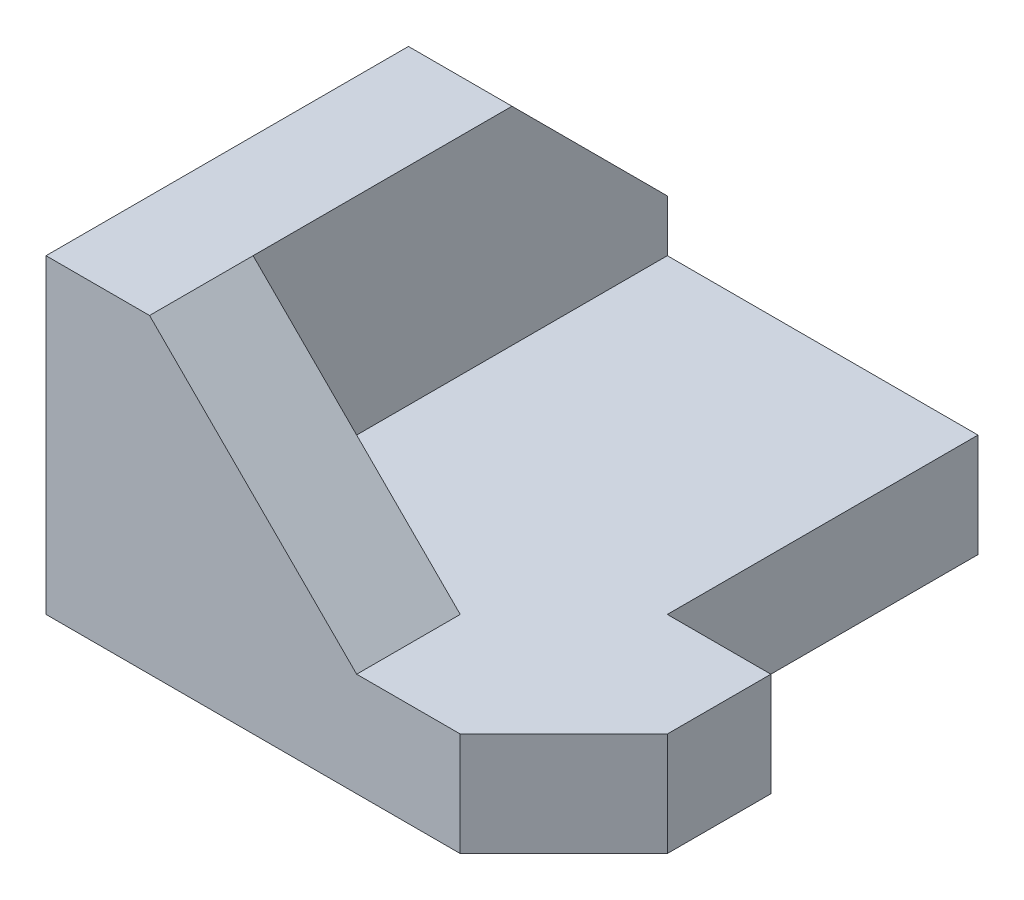
ISO-10303-21;
HEADER;
FILE_DESCRIPTION(('STEP AP214'),'2;1');
FILE_NAME('part.step','',(''),(''),'','','');
FILE_SCHEMA(('AUTOMOTIVE_DESIGN { 1 0 10303 214 1 1 1 1 }'));
ENDSEC;
DATA;
#1=APPLICATION_CONTEXT('core data for automotive mechanical design processes');
#2=APPLICATION_PROTOCOL_DEFINITION('international standard','automotive_design',2000,#1);
#3=PRODUCT_CONTEXT('',#1,'mechanical');
#4=PRODUCT('Part','Part','',(#3));
#5=PRODUCT_RELATED_PRODUCT_CATEGORY('part','',(#4));
#6=PRODUCT_DEFINITION_FORMATION('','',#4);
#7=PRODUCT_DEFINITION_CONTEXT('part definition',#1,'design');
#8=PRODUCT_DEFINITION('design','',#6,#7);
#9=PRODUCT_DEFINITION_SHAPE('','',#8);
#10=(LENGTH_UNIT() NAMED_UNIT(*) SI_UNIT(.MILLI.,.METRE.));
#11=(NAMED_UNIT(*) PLANE_ANGLE_UNIT() SI_UNIT($,.RADIAN.));
#12=(NAMED_UNIT(*) SI_UNIT($,.STERADIAN.) SOLID_ANGLE_UNIT());
#13=UNCERTAINTY_MEASURE_WITH_UNIT(LENGTH_MEASURE(1.E-05),#10,'distance_accuracy_value','');
#14=(GEOMETRIC_REPRESENTATION_CONTEXT(3) GLOBAL_UNCERTAINTY_ASSIGNED_CONTEXT((#13)) GLOBAL_UNIT_ASSIGNED_CONTEXT((#10,
#11,#12)) REPRESENTATION_CONTEXT('',''));
#15=CARTESIAN_POINT('',(0.,0.,0.));
#16=DIRECTION('',(0.,0.,1.));
#17=DIRECTION('',(1.,0.,0.));
#18=AXIS2_PLACEMENT_3D('',#15,#16,#17);
#19=CARTESIAN_POINT('',(10.,30.,0.));
#20=DIRECTION('',(1.,0.,0.));
#21=DIRECTION('',(0.,0.,-1.));
#22=AXIS2_PLACEMENT_3D('',#19,#20,#21);
#23=PLANE('',#22);
#24=DIRECTION('',(0.,0.,1.));
#25=VECTOR('',#24,1.);
#26=CARTESIAN_POINT('',(10.,30.,0.));
#27=LINE('',#26,#25);
#28=CARTESIAN_POINT('',(10.,30.,-34.9999999999999));
#29=VERTEX_POINT('',#28);
#30=CARTESIAN_POINT('',(10.,30.,-10.));
#31=VERTEX_POINT('',#30);
#32=EDGE_CURVE('E139',#29,#31,#27,.T.);
#33=ORIENTED_EDGE('',*,*,#32,.T.);
#34=DIRECTION('',(0.,-1.,0.));
#35=VECTOR('',#34,1.);
#36=CARTESIAN_POINT('',(10.,30.,-10.));
#37=LINE('',#36,#35);
#38=CARTESIAN_POINT('',(10.,10.,-10.));
#39=VERTEX_POINT('',#38);
#40=EDGE_CURVE('E129',#31,#39,#37,.T.);
#41=ORIENTED_EDGE('',*,*,#40,.T.);
#42=DIRECTION('',(0.,0.,1.));
#43=VECTOR('',#42,1.);
#44=CARTESIAN_POINT('',(10.,10.,0.));
#45=LINE('',#44,#43);
#46=CARTESIAN_POINT('',(10.,10.,-50.));
#47=VERTEX_POINT('',#46);
#48=EDGE_CURVE('E137',#47,#39,#45,.T.);
#49=ORIENTED_EDGE('',*,*,#48,.F.);
#50=DIRECTION('',(0.,-1.,0.));
#51=VECTOR('',#50,1.);
#52=CARTESIAN_POINT('',(10.,30.,-50.));
#53=LINE('',#52,#51);
#54=CARTESIAN_POINT('',(10.,15.,-50.));
#55=VERTEX_POINT('',#54);
#56=EDGE_CURVE('E197',#55,#47,#53,.T.);
#57=ORIENTED_EDGE('',*,*,#56,.F.);
#58=DIRECTION('',(0.,-0.707106781186546,-0.707106781186549));
#59=VECTOR('',#58,1.);
#60=CARTESIAN_POINT('',(10.,47.5,-17.4999999999999));
#61=LINE('',#60,#59);
#62=EDGE_CURVE('E62',#55,#29,#61,.F.);
#63=ORIENTED_EDGE('',*,*,#62,.T.);
#64=EDGE_LOOP('',(#33,#41,#49,#57,#63));
#65=FACE_BOUND('',#64,.T.);
#66=ADVANCED_FACE('F39',(#65),#23,.T.);
#67=CARTESIAN_POINT('',(0.,30.,-50.));
#68=DIRECTION('',(0.,0.,-1.));
#69=DIRECTION('',(-1.,0.,0.));
#70=AXIS2_PLACEMENT_3D('',#67,#68,#69);
#71=PLANE('',#70);
#72=DIRECTION('',(0.,-1.,0.));
#73=VECTOR('',#72,1.);
#74=CARTESIAN_POINT('',(0.,30.,-50.));
#75=LINE('',#74,#73);
#76=CARTESIAN_POINT('',(0.,15.,-50.));
#77=VERTEX_POINT('',#76);
#78=CARTESIAN_POINT('',(0.,0.,-50.));
#79=VERTEX_POINT('',#78);
#80=EDGE_CURVE('E195',#77,#79,#75,.T.);
#81=ORIENTED_EDGE('',*,*,#80,.F.);
#82=DIRECTION('',(1.,0.,0.));
#83=VECTOR('',#82,1.);
#84=CARTESIAN_POINT('',(0.,15.,-50.));
#85=LINE('',#84,#83);
#86=EDGE_CURVE('E208',#77,#55,#85,.T.);
#87=ORIENTED_EDGE('',*,*,#86,.T.);
#88=ORIENTED_EDGE('',*,*,#56,.T.);
#89=DIRECTION('',(1.,0.,0.));
#90=VECTOR('',#89,1.);
#91=CARTESIAN_POINT('',(0.,10.,-50.));
#92=LINE('',#91,#90);
#93=CARTESIAN_POINT('',(40.,10.,-50.));
#94=VERTEX_POINT('',#93);
#95=EDGE_CURVE('E145',#47,#94,#92,.T.);
#96=ORIENTED_EDGE('',*,*,#95,.T.);
#97=DIRECTION('',(0.,-1.,0.));
#98=VECTOR('',#97,1.);
#99=CARTESIAN_POINT('',(40.,10.,-50.));
#100=LINE('',#99,#98);
#101=CARTESIAN_POINT('',(40.,0.,-50.));
#102=VERTEX_POINT('',#101);
#103=EDGE_CURVE('E163',#94,#102,#100,.T.);
#104=ORIENTED_EDGE('',*,*,#103,.T.);
#105=DIRECTION('',(1.,0.,0.));
#106=VECTOR('',#105,1.);
#107=CARTESIAN_POINT('',(0.,0.,-50.));
#108=LINE('',#107,#106);
#109=EDGE_CURVE('E179',#79,#102,#108,.T.);
#110=ORIENTED_EDGE('',*,*,#109,.F.);
#111=EDGE_LOOP('',(#81,#87,#88,#96,#104,#110));
#112=FACE_BOUND('',#111,.T.);
#113=ADVANCED_FACE('F214',(#112),#71,.T.);
#114=CARTESIAN_POINT('',(0.,30.,0.));
#115=DIRECTION('',(-1.,0.,0.));
#116=DIRECTION('',(0.,0.,1.));
#117=AXIS2_PLACEMENT_3D('',#114,#115,#116);
#118=PLANE('',#117);
#119=DIRECTION('',(0.,0.,-1.));
#120=VECTOR('',#119,1.);
#121=CARTESIAN_POINT('',(0.,30.,0.));
#122=LINE('',#121,#120);
#123=CARTESIAN_POINT('',(0.,30.,0.));
#124=VERTEX_POINT('',#123);
#125=CARTESIAN_POINT('',(0.,30.,-34.9999999999999));
#126=VERTEX_POINT('',#125);
#127=EDGE_CURVE('E181',#124,#126,#122,.T.);
#128=ORIENTED_EDGE('',*,*,#127,.T.);
#129=DIRECTION('',(0.,0.707106781186546,0.707106781186549));
#130=VECTOR('',#129,1.);
#131=CARTESIAN_POINT('',(0.,47.5,-17.4999999999999));
#132=LINE('',#131,#130);
#133=EDGE_CURVE('E11',#126,#77,#132,.F.);
#134=ORIENTED_EDGE('',*,*,#133,.T.);
#135=ORIENTED_EDGE('',*,*,#80,.T.);
#136=DIRECTION('',(0.,0.,-1.));
#137=VECTOR('',#136,1.);
#138=CARTESIAN_POINT('',(0.,0.,0.));
#139=LINE('',#138,#137);
#140=CARTESIAN_POINT('',(0.,0.,0.));
#141=VERTEX_POINT('',#140);
#142=EDGE_CURVE('E189',#141,#79,#139,.T.);
#143=ORIENTED_EDGE('',*,*,#142,.F.);
#144=DIRECTION('',(0.,-1.,0.));
#145=VECTOR('',#144,1.);
#146=CARTESIAN_POINT('',(0.,30.,0.));
#147=LINE('',#146,#145);
#148=EDGE_CURVE('E187',#124,#141,#147,.T.);
#149=ORIENTED_EDGE('',*,*,#148,.F.);
#150=EDGE_LOOP('',(#128,#134,#135,#143,#149));
#151=FACE_BOUND('',#150,.T.);
#152=ADVANCED_FACE('F219',(#151),#118,.T.);
#153=CARTESIAN_POINT('',(0.,30.,0.));
#154=DIRECTION('',(0.,0.,1.));
#155=DIRECTION('',(1.,0.,0.));
#156=AXIS2_PLACEMENT_3D('',#153,#154,#155);
#157=PLANE('',#156);
#158=DIRECTION('',(-1.,0.,0.));
#159=VECTOR('',#158,1.);
#160=CARTESIAN_POINT('',(0.,0.,0.));
#161=LINE('',#160,#159);
#162=CARTESIAN_POINT('',(40.,0.,0.));
#163=VERTEX_POINT('',#162);
#164=EDGE_CURVE('E182',#163,#141,#161,.T.);
#165=ORIENTED_EDGE('',*,*,#164,.F.);
#166=DIRECTION('',(0.,1.,0.));
#167=VECTOR('',#166,1.);
#168=CARTESIAN_POINT('',(40.,30.,0.));
#169=LINE('',#168,#167);
#170=CARTESIAN_POINT('',(40.,10.,0.));
#171=VERTEX_POINT('',#170);
#172=EDGE_CURVE('E204',#163,#171,#169,.T.);
#173=ORIENTED_EDGE('',*,*,#172,.T.);
#174=DIRECTION('',(-1.,0.,0.));
#175=VECTOR('',#174,1.);
#176=CARTESIAN_POINT('',(0.,10.,0.));
#177=LINE('',#176,#175);
#178=CARTESIAN_POINT('',(30.,10.,0.));
#179=VERTEX_POINT('',#178);
#180=EDGE_CURVE('E146',#171,#179,#177,.T.);
#181=ORIENTED_EDGE('',*,*,#180,.T.);
#182=DIRECTION('',(-0.707106781186548,0.707106781186547,0.));
#183=VECTOR('',#182,1.);
#184=CARTESIAN_POINT('',(30.,10.,0.));
#185=LINE('',#184,#183);
#186=CARTESIAN_POINT('',(10.,30.,0.));
#187=VERTEX_POINT('',#186);
#188=EDGE_CURVE('E140',#179,#187,#185,.T.);
#189=ORIENTED_EDGE('',*,*,#188,.T.);
#190=DIRECTION('',(-1.,0.,0.));
#191=VECTOR('',#190,1.);
#192=CARTESIAN_POINT('',(0.,30.,0.));
#193=LINE('',#192,#191);
#194=EDGE_CURVE('E184',#187,#124,#193,.T.);
#195=ORIENTED_EDGE('',*,*,#194,.T.);
#196=ORIENTED_EDGE('',*,*,#148,.T.);
#197=EDGE_LOOP('',(#165,#173,#181,#189,#195,#196));
#198=FACE_BOUND('',#197,.T.);
#199=ADVANCED_FACE('F227',(#198),#157,.T.);
#200=CARTESIAN_POINT('',(0.,30.,0.));
#201=DIRECTION('',(0.,1.,0.));
#202=DIRECTION('',(0.,0.,1.));
#203=AXIS2_PLACEMENT_3D('',#200,#201,#202);
#204=PLANE('',#203);
#205=ORIENTED_EDGE('',*,*,#32,.F.);
#206=DIRECTION('',(-1.,0.,0.));
#207=VECTOR('',#206,1.);
#208=CARTESIAN_POINT('',(0.,30.,-34.9999999999999));
#209=LINE('',#208,#207);
#210=EDGE_CURVE('E48',#29,#126,#209,.T.);
#211=ORIENTED_EDGE('',*,*,#210,.T.);
#212=ORIENTED_EDGE('',*,*,#127,.F.);
#213=ORIENTED_EDGE('',*,*,#194,.F.);
#214=DIRECTION('',(0.,0.,1.));
#215=VECTOR('',#214,1.);
#216=CARTESIAN_POINT('',(10.,30.,-10.));
#217=LINE('',#216,#215);
#218=EDGE_CURVE('E168',#31,#187,#217,.T.);
#219=ORIENTED_EDGE('',*,*,#218,.F.);
#220=EDGE_LOOP('',(#205,#211,#212,#213,#219));
#221=FACE_BOUND('',#220,.T.);
#222=ADVANCED_FACE('F222',(#221),#204,.T.);
#223=CARTESIAN_POINT('',(0.,0.,0.));
#224=DIRECTION('',(0.,1.,0.));
#225=DIRECTION('',(0.,0.,1.));
#226=AXIS2_PLACEMENT_3D('',#223,#224,#225);
#227=PLANE('',#226);
#228=DIRECTION('',(0.,0.,1.));
#229=VECTOR('',#228,1.);
#230=CARTESIAN_POINT('',(50.,0.,0.));
#231=LINE('',#230,#229);
#232=CARTESIAN_POINT('',(50.,0.,-20.));
#233=VERTEX_POINT('',#232);
#234=CARTESIAN_POINT('',(50.,0.,-10.));
#235=VERTEX_POINT('',#234);
#236=EDGE_CURVE('E164',#233,#235,#231,.T.);
#237=ORIENTED_EDGE('',*,*,#236,.T.);
#238=DIRECTION('',(0.707106781186549,0.,-0.707106781186546));
#239=VECTOR('',#238,1.);
#240=CARTESIAN_POINT('',(50.,0.,-10.));
#241=LINE('',#240,#239);
#242=EDGE_CURVE('E202',#235,#163,#241,.F.);
#243=ORIENTED_EDGE('',*,*,#242,.T.);
#244=ORIENTED_EDGE('',*,*,#164,.T.);
#245=ORIENTED_EDGE('',*,*,#142,.T.);
#246=ORIENTED_EDGE('',*,*,#109,.T.);
#247=DIRECTION('',(0.,0.,1.));
#248=VECTOR('',#247,1.);
#249=CARTESIAN_POINT('',(40.,0.,0.));
#250=LINE('',#249,#248);
#251=CARTESIAN_POINT('',(40.,0.,-20.));
#252=VERTEX_POINT('',#251);
#253=EDGE_CURVE('E151',#102,#252,#250,.T.);
#254=ORIENTED_EDGE('',*,*,#253,.T.);
#255=DIRECTION('',(1.,0.,0.));
#256=VECTOR('',#255,1.);
#257=CARTESIAN_POINT('',(0.,0.,-20.));
#258=LINE('',#257,#256);
#259=EDGE_CURVE('E167',#252,#233,#258,.T.);
#260=ORIENTED_EDGE('',*,*,#259,.T.);
#261=EDGE_LOOP('',(#237,#243,#244,#245,#246,#254,#260));
#262=FACE_BOUND('',#261,.T.);
#263=ADVANCED_FACE('F274',(#262),#227,.F.);
#264=CARTESIAN_POINT('',(50.,10.,0.));
#265=DIRECTION('',(1.,0.,0.));
#266=DIRECTION('',(0.,0.,-1.));
#267=AXIS2_PLACEMENT_3D('',#264,#265,#266);
#268=PLANE('',#267);
#269=DIRECTION('',(0.,0.,1.));
#270=VECTOR('',#269,1.);
#271=CARTESIAN_POINT('',(50.,10.,0.));
#272=LINE('',#271,#270);
#273=CARTESIAN_POINT('',(50.,10.,-20.));
#274=VERTEX_POINT('',#273);
#275=CARTESIAN_POINT('',(50.,10.,-10.));
#276=VERTEX_POINT('',#275);
#277=EDGE_CURVE('E149',#274,#276,#272,.T.);
#278=ORIENTED_EDGE('',*,*,#277,.T.);
#279=DIRECTION('',(0.,-1.,0.));
#280=VECTOR('',#279,1.);
#281=CARTESIAN_POINT('',(50.,10.,-10.));
#282=LINE('',#281,#280);
#283=EDGE_CURVE('E199',#276,#235,#282,.T.);
#284=ORIENTED_EDGE('',*,*,#283,.T.);
#285=ORIENTED_EDGE('',*,*,#236,.F.);
#286=DIRECTION('',(0.,-1.,0.));
#287=VECTOR('',#286,1.);
#288=CARTESIAN_POINT('',(50.,10.,-20.));
#289=LINE('',#288,#287);
#290=EDGE_CURVE('E177',#274,#233,#289,.T.);
#291=ORIENTED_EDGE('',*,*,#290,.F.);
#292=EDGE_LOOP('',(#278,#284,#285,#291));
#293=FACE_BOUND('',#292,.T.);
#294=ADVANCED_FACE('F266',(#293),#268,.T.);
#295=CARTESIAN_POINT('',(0.,10.,-20.));
#296=DIRECTION('',(0.,0.,-1.));
#297=DIRECTION('',(-1.,0.,0.));
#298=AXIS2_PLACEMENT_3D('',#295,#296,#297);
#299=PLANE('',#298);
#300=ORIENTED_EDGE('',*,*,#259,.F.);
#301=DIRECTION('',(0.,-1.,0.));
#302=VECTOR('',#301,1.);
#303=CARTESIAN_POINT('',(40.,10.,-20.));
#304=LINE('',#303,#302);
#305=CARTESIAN_POINT('',(40.,10.,-20.));
#306=VERTEX_POINT('',#305);
#307=EDGE_CURVE('E175',#306,#252,#304,.T.);
#308=ORIENTED_EDGE('',*,*,#307,.F.);
#309=DIRECTION('',(1.,0.,0.));
#310=VECTOR('',#309,1.);
#311=CARTESIAN_POINT('',(0.,10.,-20.));
#312=LINE('',#311,#310);
#313=EDGE_CURVE('E157',#306,#274,#312,.T.);
#314=ORIENTED_EDGE('',*,*,#313,.T.);
#315=ORIENTED_EDGE('',*,*,#290,.T.);
#316=EDGE_LOOP('',(#300,#308,#314,#315));
#317=FACE_BOUND('',#316,.T.);
#318=ADVANCED_FACE('F270',(#317),#299,.T.);
#319=CARTESIAN_POINT('',(40.,10.,0.));
#320=DIRECTION('',(1.,0.,0.));
#321=DIRECTION('',(0.,0.,-1.));
#322=AXIS2_PLACEMENT_3D('',#319,#320,#321);
#323=PLANE('',#322);
#324=ORIENTED_EDGE('',*,*,#253,.F.);
#325=ORIENTED_EDGE('',*,*,#103,.F.);
#326=DIRECTION('',(0.,0.,1.));
#327=VECTOR('',#326,1.);
#328=CARTESIAN_POINT('',(40.,10.,0.));
#329=LINE('',#328,#327);
#330=EDGE_CURVE('E160',#94,#306,#329,.T.);
#331=ORIENTED_EDGE('',*,*,#330,.T.);
#332=ORIENTED_EDGE('',*,*,#307,.T.);
#333=EDGE_LOOP('',(#324,#325,#331,#332));
#334=FACE_BOUND('',#333,.T.);
#335=ADVANCED_FACE('F259',(#334),#323,.T.);
#336=CARTESIAN_POINT('',(0.,10.,0.));
#337=DIRECTION('',(0.,1.,0.));
#338=DIRECTION('',(0.,0.,1.));
#339=AXIS2_PLACEMENT_3D('',#336,#337,#338);
#340=PLANE('',#339);
#341=DIRECTION('',(0.,0.,1.));
#342=VECTOR('',#341,1.);
#343=CARTESIAN_POINT('',(30.,10.,-10.));
#344=LINE('',#343,#342);
#345=CARTESIAN_POINT('',(30.,10.,-10.));
#346=VERTEX_POINT('',#345);
#347=EDGE_CURVE('E233',#346,#179,#344,.T.);
#348=ORIENTED_EDGE('',*,*,#347,.T.);
#349=ORIENTED_EDGE('',*,*,#180,.F.);
#350=DIRECTION('',(-0.707106781186549,0.,0.707106781186546));
#351=VECTOR('',#350,1.);
#352=CARTESIAN_POINT('',(19.9999999999999,10.,20.));
#353=LINE('',#352,#351);
#354=EDGE_CURVE('E206',#171,#276,#353,.F.);
#355=ORIENTED_EDGE('',*,*,#354,.T.);
#356=ORIENTED_EDGE('',*,*,#277,.F.);
#357=ORIENTED_EDGE('',*,*,#313,.F.);
#358=ORIENTED_EDGE('',*,*,#330,.F.);
#359=ORIENTED_EDGE('',*,*,#95,.F.);
#360=ORIENTED_EDGE('',*,*,#48,.T.);
#361=DIRECTION('',(1.,0.,0.));
#362=VECTOR('',#361,1.);
#363=CARTESIAN_POINT('',(10.,10.,-10.));
#364=LINE('',#363,#362);
#365=EDGE_CURVE('E126',#39,#346,#364,.T.);
#366=ORIENTED_EDGE('',*,*,#365,.T.);
#367=EDGE_LOOP('',(#348,#349,#355,#356,#357,#358,#359,#360,#366));
#368=FACE_BOUND('',#367,.T.);
#369=ADVANCED_FACE('F142',(#368),#340,.T.);
#370=CARTESIAN_POINT('',(50.,10.,-10.));
#371=DIRECTION('',(-0.707106781186546,0.,-0.707106781186549));
#372=DIRECTION('',(0.,-1.,0.));
#373=AXIS2_PLACEMENT_3D('',#370,#371,#372);
#374=PLANE('',#373);
#375=ORIENTED_EDGE('',*,*,#354,.F.);
#376=ORIENTED_EDGE('',*,*,#172,.F.);
#377=ORIENTED_EDGE('',*,*,#242,.F.);
#378=ORIENTED_EDGE('',*,*,#283,.F.);
#379=EDGE_LOOP('',(#375,#376,#377,#378));
#380=FACE_BOUND('',#379,.T.);
#381=ADVANCED_FACE('F242',(#380),#374,.F.);
#382=CARTESIAN_POINT('',(0.,15.,-50.));
#383=DIRECTION('',(0.,-0.707106781186549,0.707106781186546));
#384=DIRECTION('',(1.,0.,0.));
#385=AXIS2_PLACEMENT_3D('',#382,#383,#384);
#386=PLANE('',#385);
#387=ORIENTED_EDGE('',*,*,#133,.F.);
#388=ORIENTED_EDGE('',*,*,#210,.F.);
#389=ORIENTED_EDGE('',*,*,#62,.F.);
#390=ORIENTED_EDGE('',*,*,#86,.F.);
#391=EDGE_LOOP('',(#387,#388,#389,#390));
#392=FACE_BOUND('',#391,.T.);
#393=ADVANCED_FACE('F42',(#392),#386,.F.);
#394=CARTESIAN_POINT('',(30.,10.,-10.));
#395=DIRECTION('',(0.707106781186547,0.707106781186548,0.));
#396=DIRECTION('',(-0.707106781186548,0.707106781186547,0.));
#397=AXIS2_PLACEMENT_3D('',#394,#395,#396);
#398=PLANE('',#397);
#399=ORIENTED_EDGE('',*,*,#188,.F.);
#400=ORIENTED_EDGE('',*,*,#347,.F.);
#401=DIRECTION('',(-0.707106781186548,0.707106781186547,0.));
#402=VECTOR('',#401,1.);
#403=CARTESIAN_POINT('',(30.,10.,-10.));
#404=LINE('',#403,#402);
#405=EDGE_CURVE('E131',#346,#31,#404,.T.);
#406=ORIENTED_EDGE('',*,*,#405,.T.);
#407=ORIENTED_EDGE('',*,*,#218,.T.);
#408=EDGE_LOOP('',(#399,#400,#406,#407));
#409=FACE_BOUND('',#408,.T.);
#410=ADVANCED_FACE('F234',(#409),#398,.T.);
#411=CARTESIAN_POINT('',(0.,0.,-10.));
#412=DIRECTION('',(0.,0.,1.));
#413=DIRECTION('',(1.,0.,0.));
#414=AXIS2_PLACEMENT_3D('',#411,#412,#413);
#415=PLANE('',#414);
#416=ORIENTED_EDGE('',*,*,#40,.F.);
#417=ORIENTED_EDGE('',*,*,#405,.F.);
#418=ORIENTED_EDGE('',*,*,#365,.F.);
#419=EDGE_LOOP('',(#416,#417,#418));
#420=FACE_BOUND('',#419,.T.);
#421=ADVANCED_FACE('F128',(#420),#415,.F.);
#422=CLOSED_SHELL('',(#66,#113,#152,#199,#222,#263,#294,#318,#335,#369,#381,#393,#410,#421));
#423=MANIFOLD_SOLID_BREP('B2',#422);
#424=ADVANCED_BREP_SHAPE_REPRESENTATION('',(#18,#423),#14);
#425=SHAPE_DEFINITION_REPRESENTATION(#9,#424);
ENDSEC;
END-ISO-10303-21;
